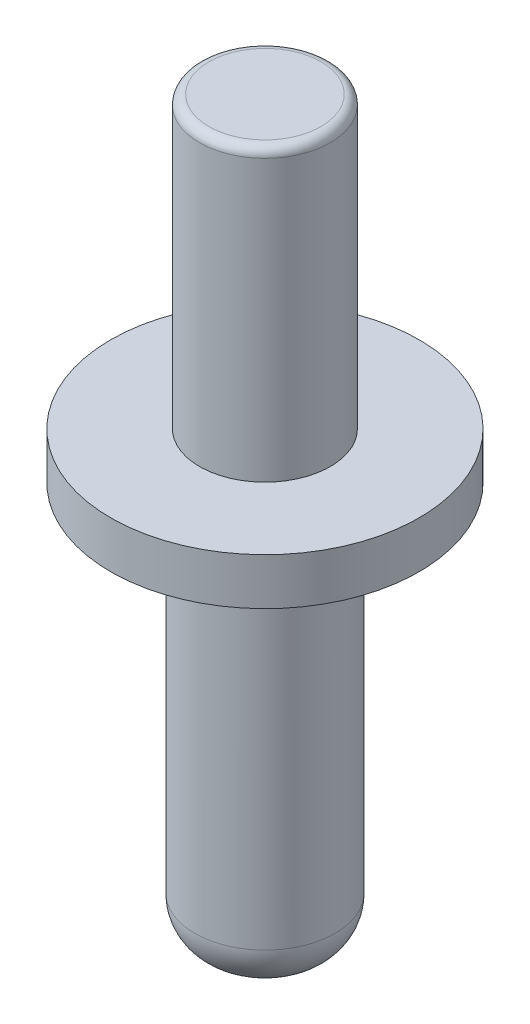
ISO-10303-21;
HEADER;
FILE_DESCRIPTION(('STEP AP214'),'2;1');
FILE_NAME('part.step','',(''),(''),'','','');
FILE_SCHEMA(('AUTOMOTIVE_DESIGN { 1 0 10303 214 1 1 1 1 }'));
ENDSEC;
DATA;
#1=APPLICATION_CONTEXT('core data for automotive mechanical design processes');
#2=APPLICATION_PROTOCOL_DEFINITION('international standard','automotive_design',2000,#1);
#3=PRODUCT_CONTEXT('',#1,'mechanical');
#4=PRODUCT('Part','Part','',(#3));
#5=PRODUCT_RELATED_PRODUCT_CATEGORY('part','',(#4));
#6=PRODUCT_DEFINITION_FORMATION('','',#4);
#7=PRODUCT_DEFINITION_CONTEXT('part definition',#1,'design');
#8=PRODUCT_DEFINITION('design','',#6,#7);
#9=PRODUCT_DEFINITION_SHAPE('','',#8);
#10=(LENGTH_UNIT() NAMED_UNIT(*) SI_UNIT(.MILLI.,.METRE.));
#11=(NAMED_UNIT(*) PLANE_ANGLE_UNIT() SI_UNIT($,.RADIAN.));
#12=(NAMED_UNIT(*) SI_UNIT($,.STERADIAN.) SOLID_ANGLE_UNIT());
#13=UNCERTAINTY_MEASURE_WITH_UNIT(LENGTH_MEASURE(1.E-05),#10,'distance_accuracy_value','');
#14=(GEOMETRIC_REPRESENTATION_CONTEXT(3) GLOBAL_UNCERTAINTY_ASSIGNED_CONTEXT((#13)) GLOBAL_UNIT_ASSIGNED_CONTEXT((#10,
#11,#12)) REPRESENTATION_CONTEXT('',''));
#15=CARTESIAN_POINT('',(0.,0.,0.));
#16=DIRECTION('',(0.,0.,1.));
#17=DIRECTION('',(1.,0.,0.));
#18=AXIS2_PLACEMENT_3D('',#15,#16,#17);
#19=CARTESIAN_POINT('',(0.,-4.3,0.));
#20=DIRECTION('',(0.,-1.,0.));
#21=DIRECTION('',(1.,0.,0.));
#22=AXIS2_PLACEMENT_3D('',#19,#20,#21);
#23=PLANE('',#22);
#24=CARTESIAN_POINT('',(0.,-4.3,0.));
#25=DIRECTION('',(0.,-1.,0.));
#26=DIRECTION('',(1.,0.,0.));
#27=AXIS2_PLACEMENT_3D('',#24,#25,#26);
#28=CIRCLE('',#27,0.25);
#29=CARTESIAN_POINT('',(0.250000000000002,-4.3,0.));
#30=VERTEX_POINT('',#29);
#31=EDGE_CURVE('E10',#30,#30,#28,.T.);
#32=ORIENTED_EDGE('',*,*,#31,.T.);
#33=EDGE_LOOP('',(#32));
#34=FACE_BOUND('',#33,.T.);
#35=ADVANCED_FACE('F33',(#34),#23,.T.);
#36=CARTESIAN_POINT('',(0.,16.2872424560707,0.));
#37=DIRECTION('',(0.,1.,0.));
#38=DIRECTION('',(-1.,0.,0.));
#39=AXIS2_PLACEMENT_3D('',#36,#37,#38);
#40=CYLINDRICAL_SURFACE('',#39,0.75);
#41=CARTESIAN_POINT('',(0.,-3.8,0.));
#42=DIRECTION('',(0.,-1.,0.));
#43=DIRECTION('',(1.,0.,0.));
#44=AXIS2_PLACEMENT_3D('',#41,#42,#43);
#45=CIRCLE('',#44,0.75);
#46=CARTESIAN_POINT('',(0.750000000000002,-3.8,0.));
#47=VERTEX_POINT('',#46);
#48=EDGE_CURVE('E40',#47,#47,#45,.F.);
#49=ORIENTED_EDGE('',*,*,#48,.T.);
#50=EDGE_LOOP('',(#49));
#51=FACE_BOUND('',#50,.T.);
#52=CARTESIAN_POINT('',(0.,0.,0.));
#53=DIRECTION('',(0.,1.,0.));
#54=DIRECTION('',(-1.,0.,0.));
#55=AXIS2_PLACEMENT_3D('',#52,#53,#54);
#56=CIRCLE('',#55,0.75);
#57=CARTESIAN_POINT('',(-0.749999999999998,0.,0.));
#58=VERTEX_POINT('',#57);
#59=EDGE_CURVE('E53',#58,#58,#56,.T.);
#60=ORIENTED_EDGE('',*,*,#59,.F.);
#61=EDGE_LOOP('',(#60));
#62=FACE_BOUND('',#61,.T.);
#63=ADVANCED_FACE('F84',(#51,#62),#40,.T.);
#64=CARTESIAN_POINT('',(-0.749999999999998,0.,0.));
#65=DIRECTION('',(0.,-1.,0.));
#66=DIRECTION('',(1.,0.,0.));
#67=AXIS2_PLACEMENT_3D('',#64,#65,#66);
#68=PLANE('',#67);
#69=ORIENTED_EDGE('',*,*,#59,.T.);
#70=EDGE_LOOP('',(#69));
#71=FACE_BOUND('',#70,.T.);
#72=CARTESIAN_POINT('',(0.,0.,0.));
#73=DIRECTION('',(0.,1.,0.));
#74=DIRECTION('',(-1.,0.,0.));
#75=AXIS2_PLACEMENT_3D('',#72,#73,#74);
#76=CIRCLE('',#75,1.65);
#77=CARTESIAN_POINT('',(-1.65,0.,0.));
#78=VERTEX_POINT('',#77);
#79=EDGE_CURVE('E56',#78,#78,#76,.T.);
#80=ORIENTED_EDGE('',*,*,#79,.F.);
#81=EDGE_LOOP('',(#80));
#82=FACE_BOUND('',#81,.T.);
#83=ADVANCED_FACE('F80',(#71,#82),#68,.T.);
#84=CARTESIAN_POINT('',(0.,16.2872424560707,0.));
#85=DIRECTION('',(0.,1.,0.));
#86=DIRECTION('',(-1.,0.,0.));
#87=AXIS2_PLACEMENT_3D('',#84,#85,#86);
#88=CYLINDRICAL_SURFACE('',#87,1.65);
#89=ORIENTED_EDGE('',*,*,#79,.T.);
#90=EDGE_LOOP('',(#89));
#91=FACE_BOUND('',#90,.T.);
#92=CARTESIAN_POINT('',(0.,0.5,0.));
#93=DIRECTION('',(0.,1.,0.));
#94=DIRECTION('',(-1.,0.,0.));
#95=AXIS2_PLACEMENT_3D('',#92,#93,#94);
#96=CIRCLE('',#95,1.65);
#97=CARTESIAN_POINT('',(-1.65,0.5,0.));
#98=VERTEX_POINT('',#97);
#99=EDGE_CURVE('E59',#98,#98,#96,.T.);
#100=ORIENTED_EDGE('',*,*,#99,.F.);
#101=EDGE_LOOP('',(#100));
#102=FACE_BOUND('',#101,.T.);
#103=ADVANCED_FACE('F70',(#91,#102),#88,.T.);
#104=CARTESIAN_POINT('',(-1.65,0.499999999999999,0.));
#105=DIRECTION('',(0.,1.,0.));
#106=DIRECTION('',(-1.,0.,0.));
#107=AXIS2_PLACEMENT_3D('',#104,#105,#106);
#108=PLANE('',#107);
#109=ORIENTED_EDGE('',*,*,#99,.T.);
#110=EDGE_LOOP('',(#109));
#111=FACE_BOUND('',#110,.T.);
#112=CARTESIAN_POINT('',(0.,0.5,0.));
#113=DIRECTION('',(0.,1.,0.));
#114=DIRECTION('',(-1.,0.,0.));
#115=AXIS2_PLACEMENT_3D('',#112,#113,#114);
#116=CIRCLE('',#115,0.7);
#117=CARTESIAN_POINT('',(-0.699999999999998,0.5,0.));
#118=VERTEX_POINT('',#117);
#119=EDGE_CURVE('E62',#118,#118,#116,.T.);
#120=ORIENTED_EDGE('',*,*,#119,.F.);
#121=EDGE_LOOP('',(#120));
#122=FACE_BOUND('',#121,.T.);
#123=ADVANCED_FACE('F68',(#111,#122),#108,.T.);
#124=CARTESIAN_POINT('',(0.,16.2872424560707,0.));
#125=DIRECTION('',(0.,1.,0.));
#126=DIRECTION('',(-1.,0.,0.));
#127=AXIS2_PLACEMENT_3D('',#124,#125,#126);
#128=CYLINDRICAL_SURFACE('',#127,0.7);
#129=CARTESIAN_POINT('',(0.,3.5,0.));
#130=DIRECTION('',(0.,1.,0.));
#131=DIRECTION('',(-1.,0.,0.));
#132=AXIS2_PLACEMENT_3D('',#129,#130,#131);
#133=CIRCLE('',#132,0.7);
#134=CARTESIAN_POINT('',(-0.699999999999998,3.5,0.));
#135=VERTEX_POINT('',#134);
#136=EDGE_CURVE('E44',#135,#135,#133,.F.);
#137=ORIENTED_EDGE('',*,*,#136,.T.);
#138=EDGE_LOOP('',(#137));
#139=FACE_BOUND('',#138,.T.);
#140=ORIENTED_EDGE('',*,*,#119,.T.);
#141=EDGE_LOOP('',(#140));
#142=FACE_BOUND('',#141,.T.);
#143=ADVANCED_FACE('F66',(#139,#142),#128,.T.);
#144=CARTESIAN_POINT('',(-0.699999999999998,3.6,0.));
#145=DIRECTION('',(0.,1.,0.));
#146=DIRECTION('',(-1.,0.,0.));
#147=AXIS2_PLACEMENT_3D('',#144,#145,#146);
#148=PLANE('',#147);
#149=CARTESIAN_POINT('',(0.,3.6,0.));
#150=DIRECTION('',(0.,1.,0.));
#151=DIRECTION('',(-1.,0.,0.));
#152=AXIS2_PLACEMENT_3D('',#149,#150,#151);
#153=CIRCLE('',#152,0.6);
#154=CARTESIAN_POINT('',(-0.599999999999997,3.6,0.));
#155=VERTEX_POINT('',#154);
#156=EDGE_CURVE('E48',#155,#155,#153,.T.);
#157=ORIENTED_EDGE('',*,*,#156,.T.);
#158=EDGE_LOOP('',(#157));
#159=FACE_BOUND('',#158,.T.);
#160=ADVANCED_FACE('F77',(#159),#148,.T.);
#161=CARTESIAN_POINT('',(0.,3.5,0.));
#162=DIRECTION('',(0.,1.,0.));
#163=DIRECTION('',(-1.,0.,0.));
#164=AXIS2_PLACEMENT_3D('',#161,#162,#163);
#165=TOROIDAL_SURFACE('',#164,0.6,0.1);
#166=ORIENTED_EDGE('',*,*,#136,.F.);
#167=EDGE_LOOP('',(#166));
#168=FACE_BOUND('',#167,.T.);
#169=ORIENTED_EDGE('',*,*,#156,.F.);
#170=EDGE_LOOP('',(#169));
#171=FACE_BOUND('',#170,.T.);
#172=ADVANCED_FACE('F91',(#168,#171),#165,.T.);
#173=CARTESIAN_POINT('',(0.,-3.8,0.));
#174=DIRECTION('',(0.,-1.,0.));
#175=DIRECTION('',(1.,0.,0.));
#176=AXIS2_PLACEMENT_3D('',#173,#174,#175);
#177=DEGENERATE_TOROIDAL_SURFACE('',#176,0.25,0.5,.T.);
#178=ORIENTED_EDGE('',*,*,#31,.F.);
#179=EDGE_LOOP('',(#178));
#180=FACE_BOUND('',#179,.T.);
#181=ORIENTED_EDGE('',*,*,#48,.F.);
#182=EDGE_LOOP('',(#181));
#183=FACE_BOUND('',#182,.T.);
#184=ADVANCED_FACE('F35',(#180,#183),#177,.T.);
#185=CLOSED_SHELL('',(#35,#63,#83,#103,#123,#143,#160,#172,#184));
#186=MANIFOLD_SOLID_BREP('B2',#185);
#187=ADVANCED_BREP_SHAPE_REPRESENTATION('',(#18,#186),#14);
#188=SHAPE_DEFINITION_REPRESENTATION(#9,#187);
ENDSEC;
END-ISO-10303-21;
